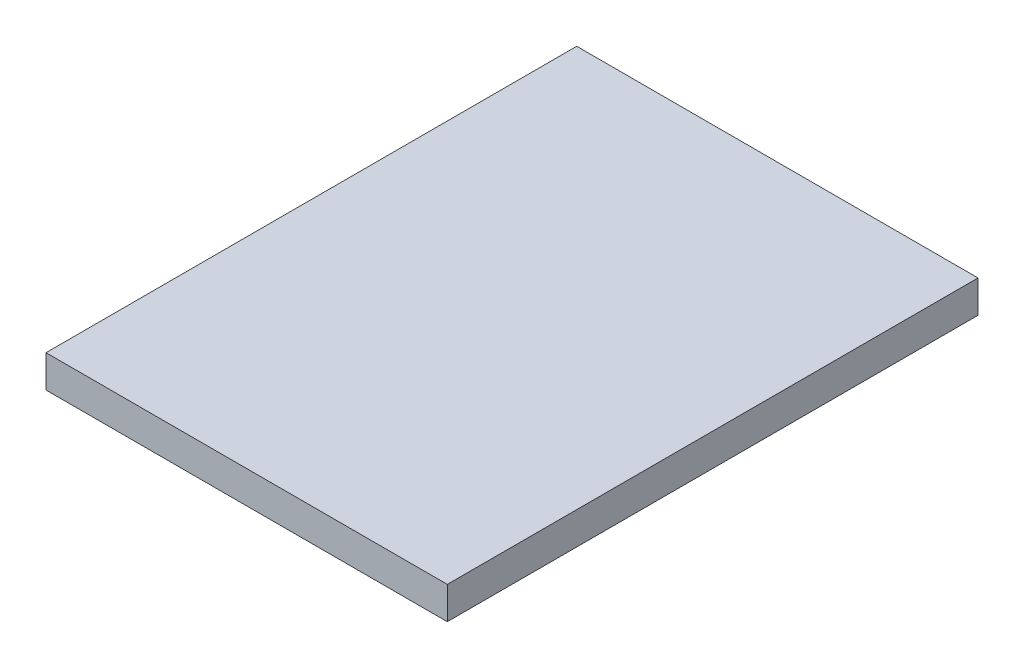
ISO-10303-21;
HEADER;
FILE_DESCRIPTION(('STEP AP214'),'2;1');
FILE_NAME('part.step','',(''),(''),'','','');
FILE_SCHEMA(('AUTOMOTIVE_DESIGN { 1 0 10303 214 1 1 1 1 }'));
ENDSEC;
DATA;
#1=APPLICATION_CONTEXT('core data for automotive mechanical design processes');
#2=APPLICATION_PROTOCOL_DEFINITION('international standard','automotive_design',2000,#1);
#3=PRODUCT_CONTEXT('',#1,'mechanical');
#4=PRODUCT('Part','Part','',(#3));
#5=PRODUCT_RELATED_PRODUCT_CATEGORY('part','',(#4));
#6=PRODUCT_DEFINITION_FORMATION('','',#4);
#7=PRODUCT_DEFINITION_CONTEXT('part definition',#1,'design');
#8=PRODUCT_DEFINITION('design','',#6,#7);
#9=PRODUCT_DEFINITION_SHAPE('','',#8);
#10=(LENGTH_UNIT() NAMED_UNIT(*) SI_UNIT(.MILLI.,.METRE.));
#11=(NAMED_UNIT(*) PLANE_ANGLE_UNIT() SI_UNIT($,.RADIAN.));
#12=(NAMED_UNIT(*) SI_UNIT($,.STERADIAN.) SOLID_ANGLE_UNIT());
#13=UNCERTAINTY_MEASURE_WITH_UNIT(LENGTH_MEASURE(1.E-05),#10,'distance_accuracy_value','');
#14=(GEOMETRIC_REPRESENTATION_CONTEXT(3) GLOBAL_UNCERTAINTY_ASSIGNED_CONTEXT((#13)) GLOBAL_UNIT_ASSIGNED_CONTEXT((#10,
#11,#12)) REPRESENTATION_CONTEXT('',''));
#15=CARTESIAN_POINT('',(0.,0.,0.));
#16=DIRECTION('',(0.,0.,1.));
#17=DIRECTION('',(1.,0.,0.));
#18=AXIS2_PLACEMENT_3D('',#15,#16,#17);
#19=CARTESIAN_POINT('',(-155.,-25.,0.));
#20=DIRECTION('',(-1.,0.,0.));
#21=DIRECTION('',(0.,0.,1.));
#22=AXIS2_PLACEMENT_3D('',#19,#20,#21);
#23=PLANE('',#22);
#24=DIRECTION('',(0.,0.,1.));
#25=VECTOR('',#24,1.);
#26=CARTESIAN_POINT('',(-155.,0.,0.));
#27=LINE('',#26,#25);
#28=CARTESIAN_POINT('',(-155.,0.,-410.));
#29=VERTEX_POINT('',#28);
#30=CARTESIAN_POINT('',(-155.,0.,0.));
#31=VERTEX_POINT('',#30);
#32=EDGE_CURVE('E118',#29,#31,#27,.T.);
#33=ORIENTED_EDGE('',*,*,#32,.F.);
#34=DIRECTION('',(0.,1.,0.));
#35=VECTOR('',#34,1.);
#36=CARTESIAN_POINT('',(-155.,-25.,-410.));
#37=LINE('',#36,#35);
#38=CARTESIAN_POINT('',(-155.,-25.,-410.));
#39=VERTEX_POINT('',#38);
#40=EDGE_CURVE('E11',#39,#29,#37,.T.);
#41=ORIENTED_EDGE('',*,*,#40,.F.);
#42=DIRECTION('',(0.,0.,1.));
#43=VECTOR('',#42,1.);
#44=CARTESIAN_POINT('',(-155.,-25.,0.));
#45=LINE('',#44,#43);
#46=CARTESIAN_POINT('',(-155.,-25.,0.));
#47=VERTEX_POINT('',#46);
#48=EDGE_CURVE('E109',#39,#47,#45,.T.);
#49=ORIENTED_EDGE('',*,*,#48,.T.);
#50=DIRECTION('',(0.,1.,0.));
#51=VECTOR('',#50,1.);
#52=CARTESIAN_POINT('',(-155.,-25.,0.));
#53=LINE('',#52,#51);
#54=EDGE_CURVE('E45',#47,#31,#53,.T.);
#55=ORIENTED_EDGE('',*,*,#54,.T.);
#56=EDGE_LOOP('',(#33,#41,#49,#55));
#57=FACE_BOUND('',#56,.T.);
#58=ADVANCED_FACE('F42',(#57),#23,.T.);
#59=CARTESIAN_POINT('',(-155.,-25.,-410.));
#60=DIRECTION('',(0.,0.,-1.));
#61=DIRECTION('',(-1.,0.,0.));
#62=AXIS2_PLACEMENT_3D('',#59,#60,#61);
#63=PLANE('',#62);
#64=DIRECTION('',(-1.,0.,0.));
#65=VECTOR('',#64,1.);
#66=CARTESIAN_POINT('',(-155.,0.,-410.));
#67=LINE('',#66,#65);
#68=CARTESIAN_POINT('',(155.,0.,-410.));
#69=VERTEX_POINT('',#68);
#70=EDGE_CURVE('E113',#69,#29,#67,.T.);
#71=ORIENTED_EDGE('',*,*,#70,.F.);
#72=DIRECTION('',(0.,1.,0.));
#73=VECTOR('',#72,1.);
#74=CARTESIAN_POINT('',(155.,-25.,-410.));
#75=LINE('',#74,#73);
#76=CARTESIAN_POINT('',(155.,-25.,-410.));
#77=VERTEX_POINT('',#76);
#78=EDGE_CURVE('E52',#77,#69,#75,.T.);
#79=ORIENTED_EDGE('',*,*,#78,.F.);
#80=DIRECTION('',(-1.,0.,0.));
#81=VECTOR('',#80,1.);
#82=CARTESIAN_POINT('',(-155.,-25.,-410.));
#83=LINE('',#82,#81);
#84=EDGE_CURVE('E104',#77,#39,#83,.T.);
#85=ORIENTED_EDGE('',*,*,#84,.T.);
#86=ORIENTED_EDGE('',*,*,#40,.T.);
#87=EDGE_LOOP('',(#71,#79,#85,#86));
#88=FACE_BOUND('',#87,.T.);
#89=ADVANCED_FACE('F132',(#88),#63,.T.);
#90=CARTESIAN_POINT('',(155.,-25.,0.));
#91=DIRECTION('',(1.,0.,0.));
#92=DIRECTION('',(0.,0.,-1.));
#93=AXIS2_PLACEMENT_3D('',#90,#91,#92);
#94=PLANE('',#93);
#95=DIRECTION('',(0.,0.,-1.));
#96=VECTOR('',#95,1.);
#97=CARTESIAN_POINT('',(155.,0.,0.));
#98=LINE('',#97,#96);
#99=CARTESIAN_POINT('',(155.,0.,0.));
#100=VERTEX_POINT('',#99);
#101=EDGE_CURVE('E98',#100,#69,#98,.T.);
#102=ORIENTED_EDGE('',*,*,#101,.F.);
#103=DIRECTION('',(0.,1.,0.));
#104=VECTOR('',#103,1.);
#105=CARTESIAN_POINT('',(155.,-25.,0.));
#106=LINE('',#105,#104);
#107=CARTESIAN_POINT('',(155.,-25.,0.));
#108=VERTEX_POINT('',#107);
#109=EDGE_CURVE('E93',#108,#100,#106,.T.);
#110=ORIENTED_EDGE('',*,*,#109,.F.);
#111=DIRECTION('',(0.,0.,-1.));
#112=VECTOR('',#111,1.);
#113=CARTESIAN_POINT('',(155.,-25.,0.));
#114=LINE('',#113,#112);
#115=EDGE_CURVE('E96',#108,#77,#114,.T.);
#116=ORIENTED_EDGE('',*,*,#115,.T.);
#117=ORIENTED_EDGE('',*,*,#78,.T.);
#118=EDGE_LOOP('',(#102,#110,#116,#117));
#119=FACE_BOUND('',#118,.T.);
#120=ADVANCED_FACE('F95',(#119),#94,.T.);
#121=CARTESIAN_POINT('',(-155.,-25.,0.));
#122=DIRECTION('',(0.,0.,1.));
#123=DIRECTION('',(1.,0.,0.));
#124=AXIS2_PLACEMENT_3D('',#121,#122,#123);
#125=PLANE('',#124);
#126=DIRECTION('',(1.,0.,0.));
#127=VECTOR('',#126,1.);
#128=CARTESIAN_POINT('',(-155.,0.,0.));
#129=LINE('',#128,#127);
#130=EDGE_CURVE('E122',#31,#100,#129,.T.);
#131=ORIENTED_EDGE('',*,*,#130,.F.);
#132=ORIENTED_EDGE('',*,*,#54,.F.);
#133=DIRECTION('',(1.,0.,0.));
#134=VECTOR('',#133,1.);
#135=CARTESIAN_POINT('',(-155.,-25.,0.));
#136=LINE('',#135,#134);
#137=EDGE_CURVE('E103',#47,#108,#136,.T.);
#138=ORIENTED_EDGE('',*,*,#137,.T.);
#139=ORIENTED_EDGE('',*,*,#109,.T.);
#140=EDGE_LOOP('',(#131,#132,#138,#139));
#141=FACE_BOUND('',#140,.T.);
#142=ADVANCED_FACE('F107',(#141),#125,.T.);
#143=CARTESIAN_POINT('',(0.,-25.,0.));
#144=DIRECTION('',(0.,-1.,0.));
#145=DIRECTION('',(0.,0.,-1.));
#146=AXIS2_PLACEMENT_3D('',#143,#144,#145);
#147=PLANE('',#146);
#148=ORIENTED_EDGE('',*,*,#48,.F.);
#149=ORIENTED_EDGE('',*,*,#84,.F.);
#150=ORIENTED_EDGE('',*,*,#115,.F.);
#151=ORIENTED_EDGE('',*,*,#137,.F.);
#152=EDGE_LOOP('',(#148,#149,#150,#151));
#153=FACE_BOUND('',#152,.T.);
#154=ADVANCED_FACE('F102',(#153),#147,.T.);
#155=CARTESIAN_POINT('',(0.,0.,0.));
#156=DIRECTION('',(0.,-1.,0.));
#157=DIRECTION('',(0.,0.,-1.));
#158=AXIS2_PLACEMENT_3D('',#155,#156,#157);
#159=PLANE('',#158);
#160=ORIENTED_EDGE('',*,*,#32,.T.);
#161=ORIENTED_EDGE('',*,*,#130,.T.);
#162=ORIENTED_EDGE('',*,*,#101,.T.);
#163=ORIENTED_EDGE('',*,*,#70,.T.);
#164=EDGE_LOOP('',(#160,#161,#162,#163));
#165=FACE_BOUND('',#164,.T.);
#166=ADVANCED_FACE('F131',(#165),#159,.F.);
#167=CLOSED_SHELL('',(#58,#89,#120,#142,#154,#166));
#168=MANIFOLD_SOLID_BREP('B2',#167);
#169=ADVANCED_BREP_SHAPE_REPRESENTATION('',(#18,#168),#14);
#170=SHAPE_DEFINITION_REPRESENTATION(#9,#169);
ENDSEC;
END-ISO-10303-21;
